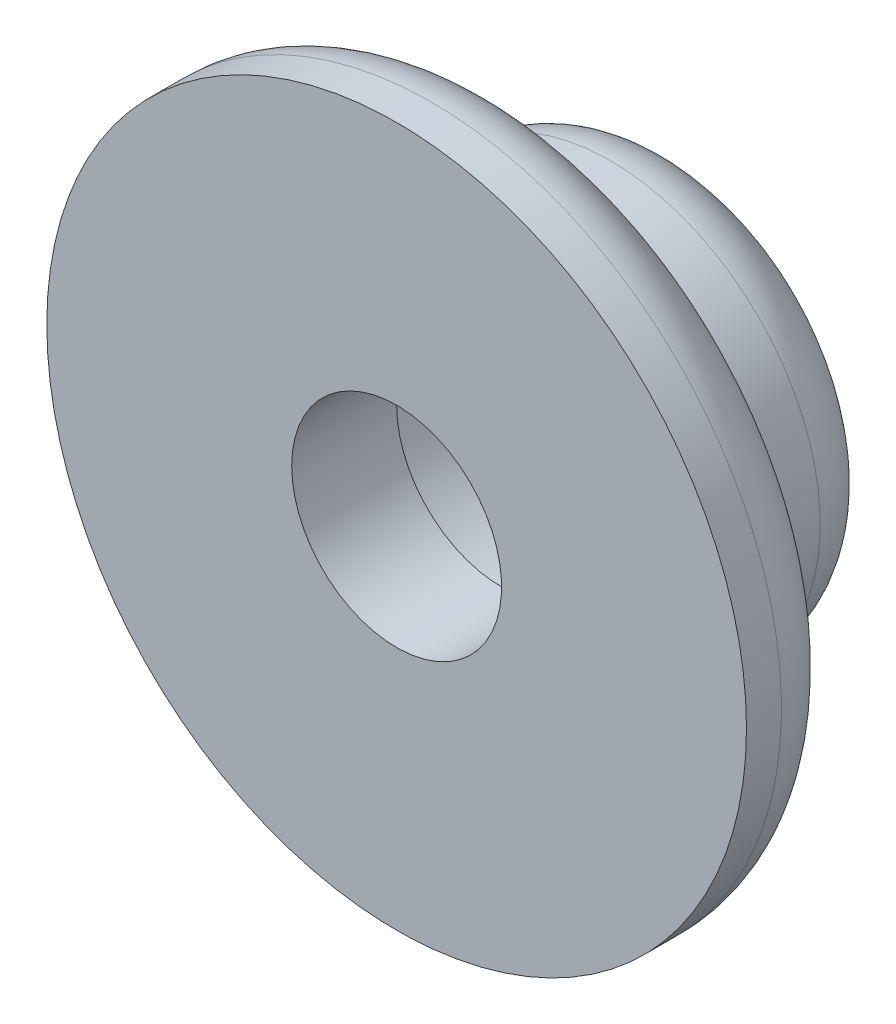
ISO-10303-21;
HEADER;
FILE_DESCRIPTION(('STEP AP214'),'2;1');
FILE_NAME('part.step','',(''),(''),'','','');
FILE_SCHEMA(('AUTOMOTIVE_DESIGN { 1 0 10303 214 1 1 1 1 }'));
ENDSEC;
DATA;
#1=APPLICATION_CONTEXT('core data for automotive mechanical design processes');
#2=APPLICATION_PROTOCOL_DEFINITION('international standard','automotive_design',2000,#1);
#3=PRODUCT_CONTEXT('',#1,'mechanical');
#4=PRODUCT('Part','Part','',(#3));
#5=PRODUCT_RELATED_PRODUCT_CATEGORY('part','',(#4));
#6=PRODUCT_DEFINITION_FORMATION('','',#4);
#7=PRODUCT_DEFINITION_CONTEXT('part definition',#1,'design');
#8=PRODUCT_DEFINITION('design','',#6,#7);
#9=PRODUCT_DEFINITION_SHAPE('','',#8);
#10=(LENGTH_UNIT() NAMED_UNIT(*) SI_UNIT(.MILLI.,.METRE.));
#11=(NAMED_UNIT(*) PLANE_ANGLE_UNIT() SI_UNIT($,.RADIAN.));
#12=(NAMED_UNIT(*) SI_UNIT($,.STERADIAN.) SOLID_ANGLE_UNIT());
#13=UNCERTAINTY_MEASURE_WITH_UNIT(LENGTH_MEASURE(1.E-05),#10,'distance_accuracy_value','');
#14=(GEOMETRIC_REPRESENTATION_CONTEXT(3) GLOBAL_UNCERTAINTY_ASSIGNED_CONTEXT((#13)) GLOBAL_UNIT_ASSIGNED_CONTEXT((#10,
#11,#12)) REPRESENTATION_CONTEXT('',''));
#15=CARTESIAN_POINT('',(0.,0.,0.));
#16=DIRECTION('',(0.,0.,1.));
#17=DIRECTION('',(1.,0.,0.));
#18=AXIS2_PLACEMENT_3D('',#15,#16,#17);
#19=CARTESIAN_POINT('',(0.,0.,5.));
#20=DIRECTION('',(0.,0.,-1.));
#21=DIRECTION('',(-1.,0.,0.));
#22=AXIS2_PLACEMENT_3D('',#19,#20,#21);
#23=CYLINDRICAL_SURFACE('',#22,4.15);
#24=CARTESIAN_POINT('',(0.,0.,0.5));
#25=DIRECTION('',(0.,0.,1.));
#26=DIRECTION('',(1.,0.,0.));
#27=AXIS2_PLACEMENT_3D('',#24,#25,#26);
#28=CIRCLE('',#27,4.15);
#29=CARTESIAN_POINT('',(4.15,0.,0.5));
#30=VERTEX_POINT('',#29);
#31=EDGE_CURVE('E53',#30,#30,#28,.F.);
#32=ORIENTED_EDGE('',*,*,#31,.T.);
#33=EDGE_LOOP('',(#32));
#34=FACE_BOUND('',#33,.T.);
#35=CARTESIAN_POINT('',(0.,0.,5.));
#36=DIRECTION('',(0.,0.,-1.));
#37=DIRECTION('',(-1.,0.,0.));
#38=AXIS2_PLACEMENT_3D('',#35,#36,#37);
#39=CIRCLE('',#38,4.15);
#40=CARTESIAN_POINT('',(-4.15,0.,5.));
#41=VERTEX_POINT('',#40);
#42=EDGE_CURVE('E59',#41,#41,#39,.T.);
#43=ORIENTED_EDGE('',*,*,#42,.F.);
#44=EDGE_LOOP('',(#43));
#45=FACE_BOUND('',#44,.T.);
#46=ADVANCED_FACE('F33',(#34,#45),#23,.F.);
#47=CARTESIAN_POINT('',(0.,0.,5.));
#48=DIRECTION('',(0.,0.,-1.));
#49=DIRECTION('',(-1.,0.,0.));
#50=AXIS2_PLACEMENT_3D('',#47,#48,#49);
#51=PLANE('',#50);
#52=CARTESIAN_POINT('',(0.,0.,5.));
#53=DIRECTION('',(0.,0.,-1.));
#54=DIRECTION('',(-1.,0.,0.));
#55=AXIS2_PLACEMENT_3D('',#52,#53,#54);
#56=CIRCLE('',#55,3.);
#57=CARTESIAN_POINT('',(-3.,0.,5.));
#58=VERTEX_POINT('',#57);
#59=EDGE_CURVE('E66',#58,#58,#56,.T.);
#60=ORIENTED_EDGE('',*,*,#59,.F.);
#61=EDGE_LOOP('',(#60));
#62=FACE_BOUND('',#61,.T.);
#63=ORIENTED_EDGE('',*,*,#42,.T.);
#64=EDGE_LOOP('',(#63));
#65=FACE_BOUND('',#64,.T.);
#66=ADVANCED_FACE('F81',(#62,#65),#51,.T.);
#67=CARTESIAN_POINT('',(0.,0.,5.));
#68=DIRECTION('',(0.,0.,-1.));
#69=DIRECTION('',(-1.,0.,0.));
#70=AXIS2_PLACEMENT_3D('',#67,#68,#69);
#71=PLANE('',#70);
#72=CARTESIAN_POINT('',(0.,0.,5.));
#73=DIRECTION('',(0.,0.,-1.));
#74=DIRECTION('',(-1.,0.,0.));
#75=AXIS2_PLACEMENT_3D('',#72,#73,#74);
#76=CIRCLE('',#75,8.);
#77=CARTESIAN_POINT('',(-8.,0.,5.));
#78=VERTEX_POINT('',#77);
#79=EDGE_CURVE('E44',#78,#78,#76,.T.);
#80=ORIENTED_EDGE('',*,*,#79,.T.);
#81=EDGE_LOOP('',(#80));
#82=FACE_BOUND('',#81,.T.);
#83=CARTESIAN_POINT('',(0.,0.,5.));
#84=DIRECTION('',(0.,0.,-1.));
#85=DIRECTION('',(-1.,0.,0.));
#86=AXIS2_PLACEMENT_3D('',#83,#84,#85);
#87=CIRCLE('',#86,6.);
#88=CARTESIAN_POINT('',(-6.,0.,5.));
#89=VERTEX_POINT('',#88);
#90=EDGE_CURVE('E62',#89,#89,#87,.T.);
#91=ORIENTED_EDGE('',*,*,#90,.F.);
#92=EDGE_LOOP('',(#91));
#93=FACE_BOUND('',#92,.T.);
#94=ADVANCED_FACE('F84',(#82,#93),#71,.T.);
#95=CARTESIAN_POINT('',(0.,0.,5.));
#96=DIRECTION('',(0.,0.,-1.));
#97=DIRECTION('',(-1.,0.,0.));
#98=AXIS2_PLACEMENT_3D('',#95,#96,#97);
#99=CYLINDRICAL_SURFACE('',#98,6.);
#100=CARTESIAN_POINT('',(0.,0.,1.89142803193777));
#101=DIRECTION('',(0.,0.,-1.));
#102=DIRECTION('',(-1.,0.,0.));
#103=AXIS2_PLACEMENT_3D('',#100,#101,#102);
#104=CIRCLE('',#103,6.);
#105=CARTESIAN_POINT('',(-6.,0.,1.89142803193777));
#106=VERTEX_POINT('',#105);
#107=EDGE_CURVE('E10',#106,#106,#104,.F.);
#108=ORIENTED_EDGE('',*,*,#107,.T.);
#109=EDGE_LOOP('',(#108));
#110=FACE_BOUND('',#109,.T.);
#111=ORIENTED_EDGE('',*,*,#90,.T.);
#112=EDGE_LOOP('',(#111));
#113=FACE_BOUND('',#112,.T.);
#114=ADVANCED_FACE('F98',(#110,#113),#99,.T.);
#115=CARTESIAN_POINT('',(0.,0.,8.));
#116=DIRECTION('',(0.,0.,1.));
#117=DIRECTION('',(1.,0.,0.));
#118=AXIS2_PLACEMENT_3D('',#115,#116,#117);
#119=PLANE('',#118);
#120=CARTESIAN_POINT('',(0.,0.,8.));
#121=DIRECTION('',(0.,0.,-1.));
#122=DIRECTION('',(-1.,0.,0.));
#123=AXIS2_PLACEMENT_3D('',#120,#121,#122);
#124=CIRCLE('',#123,3.);
#125=CARTESIAN_POINT('',(-3.,0.,8.));
#126=VERTEX_POINT('',#125);
#127=EDGE_CURVE('E65',#126,#126,#124,.T.);
#128=ORIENTED_EDGE('',*,*,#127,.T.);
#129=EDGE_LOOP('',(#128));
#130=FACE_BOUND('',#129,.T.);
#131=CARTESIAN_POINT('',(0.,0.,8.));
#132=DIRECTION('',(0.,0.,1.));
#133=DIRECTION('',(1.,0.,0.));
#134=AXIS2_PLACEMENT_3D('',#131,#132,#133);
#135=CIRCLE('',#134,10.);
#136=CARTESIAN_POINT('',(10.,0.,8.));
#137=VERTEX_POINT('',#136);
#138=EDGE_CURVE('E56',#137,#137,#135,.T.);
#139=ORIENTED_EDGE('',*,*,#138,.T.);
#140=EDGE_LOOP('',(#139));
#141=FACE_BOUND('',#140,.T.);
#142=ADVANCED_FACE('F72',(#130,#141),#119,.T.);
#143=CARTESIAN_POINT('',(0.,0.,8.));
#144=DIRECTION('',(0.,0.,-1.));
#145=DIRECTION('',(-1.,0.,0.));
#146=AXIS2_PLACEMENT_3D('',#143,#144,#145);
#147=CYLINDRICAL_SURFACE('',#146,10.);
#148=CARTESIAN_POINT('',(0.,0.,7.));
#149=DIRECTION('',(0.,0.,-1.));
#150=DIRECTION('',(-1.,0.,0.));
#151=AXIS2_PLACEMENT_3D('',#148,#149,#150);
#152=CIRCLE('',#151,10.);
#153=CARTESIAN_POINT('',(-10.,0.,7.));
#154=VERTEX_POINT('',#153);
#155=EDGE_CURVE('E40',#154,#154,#152,.F.);
#156=ORIENTED_EDGE('',*,*,#155,.T.);
#157=EDGE_LOOP('',(#156));
#158=FACE_BOUND('',#157,.T.);
#159=ORIENTED_EDGE('',*,*,#138,.F.);
#160=EDGE_LOOP('',(#159));
#161=FACE_BOUND('',#160,.T.);
#162=ADVANCED_FACE('F97',(#158,#161),#147,.T.);
#163=CARTESIAN_POINT('',(0.,0.,0.5));
#164=DIRECTION('',(0.,0.,1.));
#165=DIRECTION('',(1.,0.,0.));
#166=AXIS2_PLACEMENT_3D('',#163,#164,#165);
#167=TOROIDAL_SURFACE('',#166,4.65,0.5);
#168=CARTESIAN_POINT('',(0.,0.,0.));
#169=DIRECTION('',(0.,0.,1.));
#170=DIRECTION('',(1.,0.,0.));
#171=AXIS2_PLACEMENT_3D('',#168,#169,#170);
#172=CIRCLE('',#171,4.65);
#173=CARTESIAN_POINT('',(4.65,0.,0.));
#174=VERTEX_POINT('',#173);
#175=EDGE_CURVE('E48',#174,#174,#172,.T.);
#176=ORIENTED_EDGE('',*,*,#175,.F.);
#177=EDGE_LOOP('',(#176));
#178=FACE_BOUND('',#177,.T.);
#179=ORIENTED_EDGE('',*,*,#31,.F.);
#180=EDGE_LOOP('',(#179));
#181=FACE_BOUND('',#180,.T.);
#182=ADVANCED_FACE('F101',(#178,#181),#167,.T.);
#183=CARTESIAN_POINT('',(0.,0.,7.));
#184=DIRECTION('',(0.,0.,-1.));
#185=DIRECTION('',(-1.,0.,0.));
#186=AXIS2_PLACEMENT_3D('',#183,#184,#185);
#187=TOROIDAL_SURFACE('',#186,8.,2.);
#188=ORIENTED_EDGE('',*,*,#155,.F.);
#189=EDGE_LOOP('',(#188));
#190=FACE_BOUND('',#189,.T.);
#191=ORIENTED_EDGE('',*,*,#79,.F.);
#192=EDGE_LOOP('',(#191));
#193=FACE_BOUND('',#192,.T.);
#194=ADVANCED_FACE('F103',(#190,#193),#187,.T.);
#195=CARTESIAN_POINT('',(0.,0.,1.89142803193777));
#196=DIRECTION('',(0.,0.,-1.));
#197=DIRECTION('',(-1.,0.,0.));
#198=AXIS2_PLACEMENT_3D('',#195,#196,#197);
#199=TOROIDAL_SURFACE('',#198,4.,2.);
#200=ORIENTED_EDGE('',*,*,#107,.F.);
#201=EDGE_LOOP('',(#200));
#202=FACE_BOUND('',#201,.T.);
#203=ORIENTED_EDGE('',*,*,#175,.T.);
#204=EDGE_LOOP('',(#203));
#205=FACE_BOUND('',#204,.T.);
#206=ADVANCED_FACE('F35',(#202,#205),#199,.T.);
#207=CARTESIAN_POINT('',(0.,0.,8.));
#208=DIRECTION('',(0.,0.,-1.));
#209=DIRECTION('',(-1.,0.,0.));
#210=AXIS2_PLACEMENT_3D('',#207,#208,#209);
#211=CYLINDRICAL_SURFACE('',#210,3.);
#212=ORIENTED_EDGE('',*,*,#127,.F.);
#213=EDGE_LOOP('',(#212));
#214=FACE_BOUND('',#213,.T.);
#215=ORIENTED_EDGE('',*,*,#59,.T.);
#216=EDGE_LOOP('',(#215));
#217=FACE_BOUND('',#216,.T.);
#218=ADVANCED_FACE('F75',(#214,#217),#211,.F.);
#219=CLOSED_SHELL('',(#46,#66,#94,#114,#142,#162,#182,#194,#206,#218));
#220=MANIFOLD_SOLID_BREP('B2',#219);
#221=ADVANCED_BREP_SHAPE_REPRESENTATION('',(#18,#220),#14);
#222=SHAPE_DEFINITION_REPRESENTATION(#9,#221);
ENDSEC;
END-ISO-10303-21;
